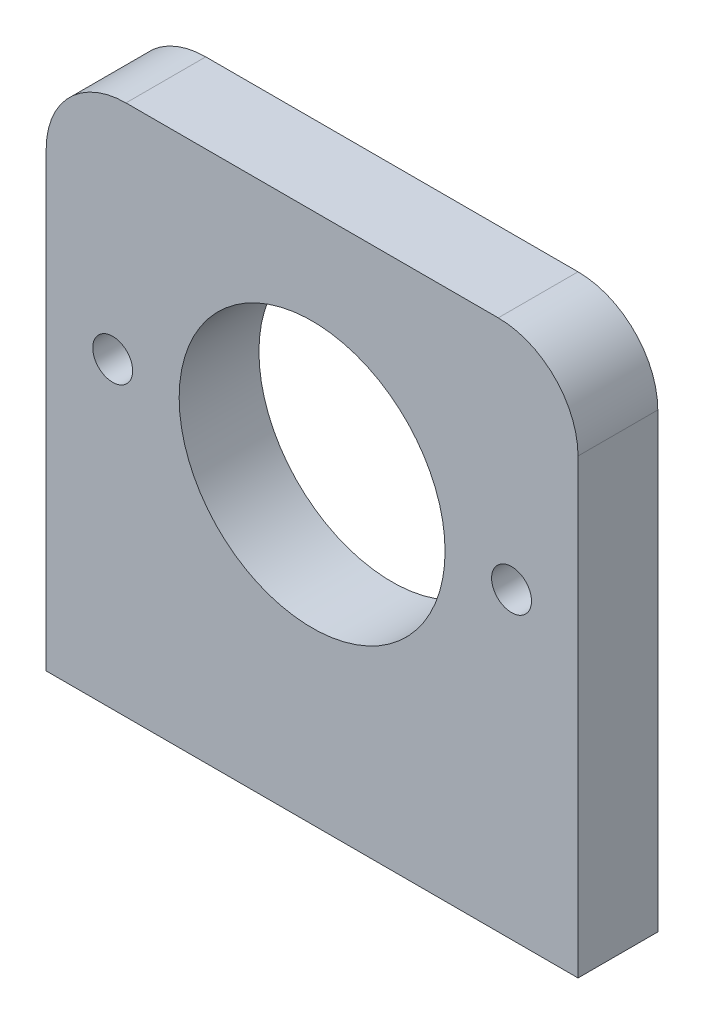
ISO-10303-21;
HEADER;
FILE_DESCRIPTION(('STEP AP214'),'2;1');
FILE_NAME('part.step','',(''),(''),'','','');
FILE_SCHEMA(('AUTOMOTIVE_DESIGN { 1 0 10303 214 1 1 1 1 }'));
ENDSEC;
DATA;
#1=APPLICATION_CONTEXT('core data for automotive mechanical design processes');
#2=APPLICATION_PROTOCOL_DEFINITION('international standard','automotive_design',2000,#1);
#3=PRODUCT_CONTEXT('',#1,'mechanical');
#4=PRODUCT('Part','Part','',(#3));
#5=PRODUCT_RELATED_PRODUCT_CATEGORY('part','',(#4));
#6=PRODUCT_DEFINITION_FORMATION('','',#4);
#7=PRODUCT_DEFINITION_CONTEXT('part definition',#1,'design');
#8=PRODUCT_DEFINITION('design','',#6,#7);
#9=PRODUCT_DEFINITION_SHAPE('','',#8);
#10=(LENGTH_UNIT() NAMED_UNIT(*) SI_UNIT(.MILLI.,.METRE.));
#11=(NAMED_UNIT(*) PLANE_ANGLE_UNIT() SI_UNIT($,.RADIAN.));
#12=(NAMED_UNIT(*) SI_UNIT($,.STERADIAN.) SOLID_ANGLE_UNIT());
#13=UNCERTAINTY_MEASURE_WITH_UNIT(LENGTH_MEASURE(1.E-05),#10,'distance_accuracy_value','');
#14=(GEOMETRIC_REPRESENTATION_CONTEXT(3) GLOBAL_UNCERTAINTY_ASSIGNED_CONTEXT((#13)) GLOBAL_UNIT_ASSIGNED_CONTEXT((#10,
#11,#12)) REPRESENTATION_CONTEXT('',''));
#15=CARTESIAN_POINT('',(0.,0.,0.));
#16=DIRECTION('',(0.,0.,1.));
#17=DIRECTION('',(1.,0.,0.));
#18=AXIS2_PLACEMENT_3D('',#15,#16,#17);
#19=CARTESIAN_POINT('',(-35.,28.,15.));
#20=DIRECTION('',(0.,0.,-1.));
#21=DIRECTION('',(-1.,0.,0.));
#22=AXIS2_PLACEMENT_3D('',#19,#20,#21);
#23=PLANE('',#22);
#24=DIRECTION('',(0.,-1.,0.));
#25=VECTOR('',#24,1.);
#26=CARTESIAN_POINT('',(-50.,-57.,15.));
#27=LINE('',#26,#25);
#28=CARTESIAN_POINT('',(-50.,28.,15.));
#29=VERTEX_POINT('',#28);
#30=CARTESIAN_POINT('',(-50.,-57.,15.));
#31=VERTEX_POINT('',#30);
#32=EDGE_CURVE('E146',#29,#31,#27,.T.);
#33=ORIENTED_EDGE('',*,*,#32,.T.);
#34=DIRECTION('',(1.,0.,0.));
#35=VECTOR('',#34,1.);
#36=CARTESIAN_POINT('',(-50.,-57.,15.));
#37=LINE('',#36,#35);
#38=CARTESIAN_POINT('',(50.,-57.,15.));
#39=VERTEX_POINT('',#38);
#40=EDGE_CURVE('E94',#31,#39,#37,.T.);
#41=ORIENTED_EDGE('',*,*,#40,.T.);
#42=DIRECTION('',(0.,1.,0.));
#43=VECTOR('',#42,1.);
#44=CARTESIAN_POINT('',(50.,-57.,15.));
#45=LINE('',#44,#43);
#46=CARTESIAN_POINT('',(50.,28.,15.));
#47=VERTEX_POINT('',#46);
#48=EDGE_CURVE('E107',#39,#47,#45,.T.);
#49=ORIENTED_EDGE('',*,*,#48,.T.);
#50=CARTESIAN_POINT('',(35.,28.,15.));
#51=DIRECTION('',(0.,0.,1.));
#52=DIRECTION('',(-1.,0.,0.));
#53=AXIS2_PLACEMENT_3D('',#50,#51,#52);
#54=CIRCLE('',#53,15.);
#55=CARTESIAN_POINT('',(35.,43.,15.));
#56=VERTEX_POINT('',#55);
#57=EDGE_CURVE('E101',#47,#56,#54,.T.);
#58=ORIENTED_EDGE('',*,*,#57,.T.);
#59=DIRECTION('',(-1.,0.,0.));
#60=VECTOR('',#59,1.);
#61=CARTESIAN_POINT('',(-35.,43.,15.));
#62=LINE('',#61,#60);
#63=CARTESIAN_POINT('',(-35.,43.,15.));
#64=VERTEX_POINT('',#63);
#65=EDGE_CURVE('E105',#56,#64,#62,.T.);
#66=ORIENTED_EDGE('',*,*,#65,.T.);
#67=CARTESIAN_POINT('',(-35.,28.,15.));
#68=DIRECTION('',(0.,0.,1.));
#69=DIRECTION('',(-1.,0.,0.));
#70=AXIS2_PLACEMENT_3D('',#67,#68,#69);
#71=CIRCLE('',#70,15.);
#72=EDGE_CURVE('E57',#64,#29,#71,.T.);
#73=ORIENTED_EDGE('',*,*,#72,.T.);
#74=EDGE_LOOP('',(#33,#41,#49,#58,#66,#73));
#75=FACE_BOUND('',#74,.T.);
#76=CARTESIAN_POINT('',(0.,0.,15.));
#77=DIRECTION('',(0.,0.,1.));
#78=DIRECTION('',(1.,0.,0.));
#79=AXIS2_PLACEMENT_3D('',#76,#77,#78);
#80=CIRCLE('',#79,25.);
#81=CARTESIAN_POINT('',(25.,0.,15.));
#82=VERTEX_POINT('',#81);
#83=EDGE_CURVE('E134',#82,#82,#80,.T.);
#84=ORIENTED_EDGE('',*,*,#83,.F.);
#85=EDGE_LOOP('',(#84));
#86=FACE_BOUND('',#85,.T.);
#87=CARTESIAN_POINT('',(-37.5,0.,15.));
#88=DIRECTION('',(0.,0.,1.));
#89=DIRECTION('',(1.,0.,0.));
#90=AXIS2_PLACEMENT_3D('',#87,#88,#89);
#91=CIRCLE('',#90,3.74999999999998);
#92=CARTESIAN_POINT('',(-33.75,0.,15.));
#93=VERTEX_POINT('',#92);
#94=EDGE_CURVE('E206',#93,#93,#91,.T.);
#95=ORIENTED_EDGE('',*,*,#94,.F.);
#96=EDGE_LOOP('',(#95));
#97=FACE_BOUND('',#96,.T.);
#98=CARTESIAN_POINT('',(37.5,0.,15.));
#99=DIRECTION('',(0.,0.,1.));
#100=DIRECTION('',(-1.,0.,0.));
#101=AXIS2_PLACEMENT_3D('',#98,#99,#100);
#102=CIRCLE('',#101,3.75000000000001);
#103=CARTESIAN_POINT('',(33.75,0.,15.));
#104=VERTEX_POINT('',#103);
#105=EDGE_CURVE('E195',#104,#104,#102,.T.);
#106=ORIENTED_EDGE('',*,*,#105,.F.);
#107=EDGE_LOOP('',(#106));
#108=FACE_BOUND('',#107,.T.);
#109=ADVANCED_FACE('F39',(#75,#86,#97,#108),#23,.F.);
#110=CARTESIAN_POINT('',(-35.,28.,0.));
#111=DIRECTION('',(0.,0.,-1.));
#112=DIRECTION('',(-1.,0.,0.));
#113=AXIS2_PLACEMENT_3D('',#110,#111,#112);
#114=PLANE('',#113);
#115=CARTESIAN_POINT('',(-37.5,0.,0.));
#116=DIRECTION('',(0.,0.,1.));
#117=DIRECTION('',(1.,0.,0.));
#118=AXIS2_PLACEMENT_3D('',#115,#116,#117);
#119=CIRCLE('',#118,3.74999999999998);
#120=CARTESIAN_POINT('',(-33.75,0.,0.));
#121=VERTEX_POINT('',#120);
#122=EDGE_CURVE('E203',#121,#121,#119,.T.);
#123=ORIENTED_EDGE('',*,*,#122,.T.);
#124=EDGE_LOOP('',(#123));
#125=FACE_BOUND('',#124,.T.);
#126=DIRECTION('',(0.,-1.,0.));
#127=VECTOR('',#126,1.);
#128=CARTESIAN_POINT('',(-50.,-57.,0.));
#129=LINE('',#128,#127);
#130=CARTESIAN_POINT('',(-50.,28.,0.));
#131=VERTEX_POINT('',#130);
#132=CARTESIAN_POINT('',(-50.,-57.,0.));
#133=VERTEX_POINT('',#132);
#134=EDGE_CURVE('E129',#131,#133,#129,.T.);
#135=ORIENTED_EDGE('',*,*,#134,.F.);
#136=CARTESIAN_POINT('',(-35.,28.,0.));
#137=DIRECTION('',(0.,0.,1.));
#138=DIRECTION('',(-1.,0.,0.));
#139=AXIS2_PLACEMENT_3D('',#136,#137,#138);
#140=CIRCLE('',#139,15.);
#141=CARTESIAN_POINT('',(-35.,43.,0.));
#142=VERTEX_POINT('',#141);
#143=EDGE_CURVE('E86',#142,#131,#140,.T.);
#144=ORIENTED_EDGE('',*,*,#143,.F.);
#145=DIRECTION('',(-1.,0.,0.));
#146=VECTOR('',#145,1.);
#147=CARTESIAN_POINT('',(-35.,43.,0.));
#148=LINE('',#147,#146);
#149=CARTESIAN_POINT('',(35.,43.,0.));
#150=VERTEX_POINT('',#149);
#151=EDGE_CURVE('E80',#150,#142,#148,.T.);
#152=ORIENTED_EDGE('',*,*,#151,.F.);
#153=CARTESIAN_POINT('',(35.,28.,0.));
#154=DIRECTION('',(0.,0.,1.));
#155=DIRECTION('',(-1.,0.,0.));
#156=AXIS2_PLACEMENT_3D('',#153,#154,#155);
#157=CIRCLE('',#156,15.);
#158=CARTESIAN_POINT('',(50.,28.,0.));
#159=VERTEX_POINT('',#158);
#160=EDGE_CURVE('E116',#159,#150,#157,.T.);
#161=ORIENTED_EDGE('',*,*,#160,.F.);
#162=DIRECTION('',(0.,1.,0.));
#163=VECTOR('',#162,1.);
#164=CARTESIAN_POINT('',(50.,-57.,0.));
#165=LINE('',#164,#163);
#166=CARTESIAN_POINT('',(50.,-57.,0.));
#167=VERTEX_POINT('',#166);
#168=EDGE_CURVE('E137',#167,#159,#165,.T.);
#169=ORIENTED_EDGE('',*,*,#168,.F.);
#170=DIRECTION('',(1.,0.,0.));
#171=VECTOR('',#170,1.);
#172=CARTESIAN_POINT('',(-50.,-57.,0.));
#173=LINE('',#172,#171);
#174=EDGE_CURVE('E133',#133,#167,#173,.T.);
#175=ORIENTED_EDGE('',*,*,#174,.F.);
#176=EDGE_LOOP('',(#135,#144,#152,#161,#169,#175));
#177=FACE_BOUND('',#176,.T.);
#178=CARTESIAN_POINT('',(0.,0.,0.));
#179=DIRECTION('',(0.,0.,1.));
#180=DIRECTION('',(1.,0.,0.));
#181=AXIS2_PLACEMENT_3D('',#178,#179,#180);
#182=CIRCLE('',#181,25.);
#183=CARTESIAN_POINT('',(25.,0.,0.));
#184=VERTEX_POINT('',#183);
#185=EDGE_CURVE('E210',#184,#184,#182,.T.);
#186=ORIENTED_EDGE('',*,*,#185,.T.);
#187=EDGE_LOOP('',(#186));
#188=FACE_BOUND('',#187,.T.);
#189=CARTESIAN_POINT('',(37.5,0.,0.));
#190=DIRECTION('',(0.,0.,1.));
#191=DIRECTION('',(-1.,0.,0.));
#192=AXIS2_PLACEMENT_3D('',#189,#190,#191);
#193=CIRCLE('',#192,3.75000000000001);
#194=CARTESIAN_POINT('',(33.75,0.,0.));
#195=VERTEX_POINT('',#194);
#196=EDGE_CURVE('E198',#195,#195,#193,.T.);
#197=ORIENTED_EDGE('',*,*,#196,.T.);
#198=EDGE_LOOP('',(#197));
#199=FACE_BOUND('',#198,.T.);
#200=ADVANCED_FACE('F159',(#125,#177,#188,#199),#114,.T.);
#201=CARTESIAN_POINT('',(-50.,-57.,15.));
#202=DIRECTION('',(1.,0.,0.));
#203=DIRECTION('',(0.,0.,-1.));
#204=AXIS2_PLACEMENT_3D('',#201,#202,#203);
#205=PLANE('',#204);
#206=ORIENTED_EDGE('',*,*,#134,.T.);
#207=DIRECTION('',(0.,0.,-1.));
#208=VECTOR('',#207,1.);
#209=CARTESIAN_POINT('',(-50.,-57.,15.));
#210=LINE('',#209,#208);
#211=EDGE_CURVE('E11',#31,#133,#210,.T.);
#212=ORIENTED_EDGE('',*,*,#211,.F.);
#213=ORIENTED_EDGE('',*,*,#32,.F.);
#214=DIRECTION('',(0.,0.,-1.));
#215=VECTOR('',#214,1.);
#216=CARTESIAN_POINT('',(-50.,28.,15.));
#217=LINE('',#216,#215);
#218=EDGE_CURVE('E125',#29,#131,#217,.T.);
#219=ORIENTED_EDGE('',*,*,#218,.T.);
#220=EDGE_LOOP('',(#206,#212,#213,#219));
#221=FACE_BOUND('',#220,.T.);
#222=ADVANCED_FACE('F41',(#221),#205,.F.);
#223=CARTESIAN_POINT('',(-50.,-57.,15.));
#224=DIRECTION('',(0.,1.,0.));
#225=DIRECTION('',(0.,0.,1.));
#226=AXIS2_PLACEMENT_3D('',#223,#224,#225);
#227=PLANE('',#226);
#228=ORIENTED_EDGE('',*,*,#174,.T.);
#229=DIRECTION('',(0.,0.,-1.));
#230=VECTOR('',#229,1.);
#231=CARTESIAN_POINT('',(50.,-57.,15.));
#232=LINE('',#231,#230);
#233=EDGE_CURVE('E49',#39,#167,#232,.T.);
#234=ORIENTED_EDGE('',*,*,#233,.F.);
#235=ORIENTED_EDGE('',*,*,#40,.F.);
#236=ORIENTED_EDGE('',*,*,#211,.T.);
#237=EDGE_LOOP('',(#228,#234,#235,#236));
#238=FACE_BOUND('',#237,.T.);
#239=ADVANCED_FACE('F267',(#238),#227,.F.);
#240=CARTESIAN_POINT('',(50.,-57.,15.));
#241=DIRECTION('',(-1.,0.,0.));
#242=DIRECTION('',(0.,0.,1.));
#243=AXIS2_PLACEMENT_3D('',#240,#241,#242);
#244=PLANE('',#243);
#245=ORIENTED_EDGE('',*,*,#168,.T.);
#246=DIRECTION('',(0.,0.,-1.));
#247=VECTOR('',#246,1.);
#248=CARTESIAN_POINT('',(50.,28.,15.));
#249=LINE('',#248,#247);
#250=EDGE_CURVE('E118',#47,#159,#249,.T.);
#251=ORIENTED_EDGE('',*,*,#250,.F.);
#252=ORIENTED_EDGE('',*,*,#48,.F.);
#253=ORIENTED_EDGE('',*,*,#233,.T.);
#254=EDGE_LOOP('',(#245,#251,#252,#253));
#255=FACE_BOUND('',#254,.T.);
#256=ADVANCED_FACE('F156',(#255),#244,.F.);
#257=CARTESIAN_POINT('',(35.,28.,15.));
#258=DIRECTION('',(0.,0.,-1.));
#259=DIRECTION('',(-1.,0.,0.));
#260=AXIS2_PLACEMENT_3D('',#257,#258,#259);
#261=CYLINDRICAL_SURFACE('',#260,15.);
#262=ORIENTED_EDGE('',*,*,#160,.T.);
#263=DIRECTION('',(0.,0.,-1.));
#264=VECTOR('',#263,1.);
#265=CARTESIAN_POINT('',(35.,43.,15.));
#266=LINE('',#265,#264);
#267=EDGE_CURVE('E113',#56,#150,#266,.T.);
#268=ORIENTED_EDGE('',*,*,#267,.F.);
#269=ORIENTED_EDGE('',*,*,#57,.F.);
#270=ORIENTED_EDGE('',*,*,#250,.T.);
#271=EDGE_LOOP('',(#262,#268,#269,#270));
#272=FACE_BOUND('',#271,.T.);
#273=ADVANCED_FACE('F114',(#272),#261,.T.);
#274=CARTESIAN_POINT('',(-35.,43.,15.));
#275=DIRECTION('',(0.,-1.,0.));
#276=DIRECTION('',(0.,0.,-1.));
#277=AXIS2_PLACEMENT_3D('',#274,#275,#276);
#278=PLANE('',#277);
#279=ORIENTED_EDGE('',*,*,#151,.T.);
#280=DIRECTION('',(0.,0.,-1.));
#281=VECTOR('',#280,1.);
#282=CARTESIAN_POINT('',(-35.,43.,15.));
#283=LINE('',#282,#281);
#284=EDGE_CURVE('E119',#64,#142,#283,.T.);
#285=ORIENTED_EDGE('',*,*,#284,.F.);
#286=ORIENTED_EDGE('',*,*,#65,.F.);
#287=ORIENTED_EDGE('',*,*,#267,.T.);
#288=EDGE_LOOP('',(#279,#285,#286,#287));
#289=FACE_BOUND('',#288,.T.);
#290=ADVANCED_FACE('F121',(#289),#278,.F.);
#291=CARTESIAN_POINT('',(-35.,28.,15.));
#292=DIRECTION('',(0.,0.,-1.));
#293=DIRECTION('',(-1.,0.,0.));
#294=AXIS2_PLACEMENT_3D('',#291,#292,#293);
#295=CYLINDRICAL_SURFACE('',#294,15.);
#296=ORIENTED_EDGE('',*,*,#143,.T.);
#297=ORIENTED_EDGE('',*,*,#218,.F.);
#298=ORIENTED_EDGE('',*,*,#72,.F.);
#299=ORIENTED_EDGE('',*,*,#284,.T.);
#300=EDGE_LOOP('',(#296,#297,#298,#299));
#301=FACE_BOUND('',#300,.T.);
#302=ADVANCED_FACE('F164',(#301),#295,.T.);
#303=CARTESIAN_POINT('',(0.,0.,15.));
#304=DIRECTION('',(0.,0.,-1.));
#305=DIRECTION('',(-1.,0.,0.));
#306=AXIS2_PLACEMENT_3D('',#303,#304,#305);
#307=CYLINDRICAL_SURFACE('',#306,25.);
#308=ORIENTED_EDGE('',*,*,#83,.T.);
#309=EDGE_LOOP('',(#308));
#310=FACE_BOUND('',#309,.T.);
#311=ORIENTED_EDGE('',*,*,#185,.F.);
#312=EDGE_LOOP('',(#311));
#313=FACE_BOUND('',#312,.T.);
#314=ADVANCED_FACE('F166',(#310,#313),#307,.F.);
#315=CARTESIAN_POINT('',(-37.5,0.,15.));
#316=DIRECTION('',(0.,0.,-1.));
#317=DIRECTION('',(-1.,0.,0.));
#318=AXIS2_PLACEMENT_3D('',#315,#316,#317);
#319=CYLINDRICAL_SURFACE('',#318,3.74999999999998);
#320=ORIENTED_EDGE('',*,*,#94,.T.);
#321=EDGE_LOOP('',(#320));
#322=FACE_BOUND('',#321,.T.);
#323=ORIENTED_EDGE('',*,*,#122,.F.);
#324=EDGE_LOOP('',(#323));
#325=FACE_BOUND('',#324,.T.);
#326=ADVANCED_FACE('F172',(#322,#325),#319,.F.);
#327=CARTESIAN_POINT('',(37.5,0.,15.));
#328=DIRECTION('',(0.,0.,-1.));
#329=DIRECTION('',(-1.,0.,0.));
#330=AXIS2_PLACEMENT_3D('',#327,#328,#329);
#331=CYLINDRICAL_SURFACE('',#330,3.75000000000001);
#332=ORIENTED_EDGE('',*,*,#105,.T.);
#333=EDGE_LOOP('',(#332));
#334=FACE_BOUND('',#333,.T.);
#335=ORIENTED_EDGE('',*,*,#196,.F.);
#336=EDGE_LOOP('',(#335));
#337=FACE_BOUND('',#336,.T.);
#338=ADVANCED_FACE('F186',(#334,#337),#331,.F.);
#339=CLOSED_SHELL('',(#109,#200,#222,#239,#256,#273,#290,#302,#314,#326,#338));
#340=MANIFOLD_SOLID_BREP('B2',#339);
#341=ADVANCED_BREP_SHAPE_REPRESENTATION('',(#18,#340),#14);
#342=SHAPE_DEFINITION_REPRESENTATION(#9,#341);
ENDSEC;
END-ISO-10303-21;
